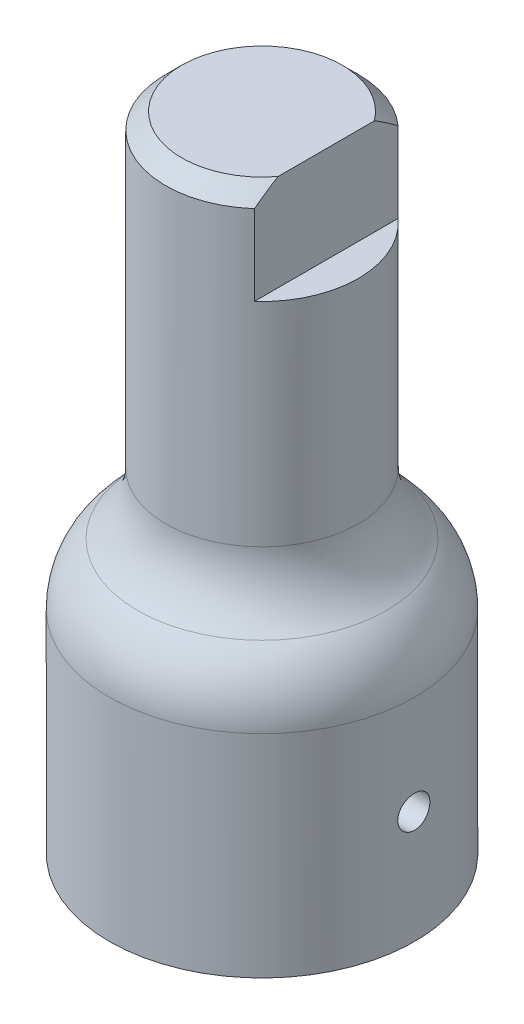
ISO-10303-21;
HEADER;
FILE_DESCRIPTION(('STEP AP214'),'2;1');
FILE_NAME('part.step','',(''),(''),'','','');
FILE_SCHEMA(('AUTOMOTIVE_DESIGN { 1 0 10303 214 1 1 1 1 }'));
ENDSEC;
DATA;
#1=APPLICATION_CONTEXT('core data for automotive mechanical design processes');
#2=APPLICATION_PROTOCOL_DEFINITION('international standard','automotive_design',2000,#1);
#3=PRODUCT_CONTEXT('',#1,'mechanical');
#4=PRODUCT('Part','Part','',(#3));
#5=PRODUCT_RELATED_PRODUCT_CATEGORY('part','',(#4));
#6=PRODUCT_DEFINITION_FORMATION('','',#4);
#7=PRODUCT_DEFINITION_CONTEXT('part definition',#1,'design');
#8=PRODUCT_DEFINITION('design','',#6,#7);
#9=PRODUCT_DEFINITION_SHAPE('','',#8);
#10=(LENGTH_UNIT() NAMED_UNIT(*) SI_UNIT(.MILLI.,.METRE.));
#11=(NAMED_UNIT(*) PLANE_ANGLE_UNIT() SI_UNIT($,.RADIAN.));
#12=(NAMED_UNIT(*) SI_UNIT($,.STERADIAN.) SOLID_ANGLE_UNIT());
#13=UNCERTAINTY_MEASURE_WITH_UNIT(LENGTH_MEASURE(1.E-05),#10,'distance_accuracy_value','');
#14=(GEOMETRIC_REPRESENTATION_CONTEXT(3) GLOBAL_UNCERTAINTY_ASSIGNED_CONTEXT((#13)) GLOBAL_UNIT_ASSIGNED_CONTEXT((#10,
#11,#12)) REPRESENTATION_CONTEXT('',''));
#15=CARTESIAN_POINT('',(0.,0.,0.));
#16=DIRECTION('',(0.,0.,1.));
#17=DIRECTION('',(1.,0.,0.));
#18=AXIS2_PLACEMENT_3D('',#15,#16,#17);
#19=CARTESIAN_POINT('',(0.,16.,0.));
#20=DIRECTION('',(0.,-1.,0.));
#21=DIRECTION('',(0.,0.,-1.));
#22=AXIS2_PLACEMENT_3D('',#19,#20,#21);
#23=CYLINDRICAL_SURFACE('',#22,6.);
#24=CARTESIAN_POINT('',(0.,14.,0.));
#25=DIRECTION('',(0.,1.,0.));
#26=DIRECTION('',(0.,0.,1.));
#27=AXIS2_PLACEMENT_3D('',#24,#25,#26);
#28=CIRCLE('',#27,6.);
#29=CARTESIAN_POINT('',(0.,14.,6.));
#30=VERTEX_POINT('',#29);
#31=EDGE_CURVE('E82',#30,#30,#28,.T.);
#32=ORIENTED_EDGE('',*,*,#31,.T.);
#33=EDGE_LOOP('',(#32));
#34=FACE_BOUND('',#33,.T.);
#35=CARTESIAN_POINT('',(0.,0.,0.));
#36=DIRECTION('',(0.,1.,0.));
#37=DIRECTION('',(0.,0.,1.));
#38=AXIS2_PLACEMENT_3D('',#35,#36,#37);
#39=CIRCLE('',#38,6.);
#40=CARTESIAN_POINT('',(0.,0.,6.));
#41=VERTEX_POINT('',#40);
#42=EDGE_CURVE('E90',#41,#41,#39,.T.);
#43=ORIENTED_EDGE('',*,*,#42,.F.);
#44=EDGE_LOOP('',(#43));
#45=FACE_BOUND('',#44,.T.);
#46=CARTESIAN_POINT('',(5.91607978309962,7.,1.));
#47=CARTESIAN_POINT('',(5.91608078960511,7.05575029925841,0.999997759368402));
#48=CARTESIAN_POINT('',(5.91687637019227,7.11153104240995,0.995322067614929));
#49=CARTESIAN_POINT('',(5.91996982947271,7.22152741728807,0.976750971230157));
#50=CARTESIAN_POINT('',(5.92226909356571,7.27574155749981,0.962847064123861));
#51=CARTESIAN_POINT('',(5.9281024372893,7.38099691334271,0.926251817466857));
#52=CARTESIAN_POINT('',(5.9316354846878,7.43204073946653,0.903567821972435));
#53=CARTESIAN_POINT('',(5.93953708845736,7.52959238188548,0.850074598756147));
#54=CARTESIAN_POINT('',(5.94390555078989,7.5761007078305,0.819266285400628));
#55=CARTESIAN_POINT('',(5.95303388461044,7.66372513989827,0.75007501078652));
#56=CARTESIAN_POINT('',(5.95779686930827,7.70479005255461,0.711627619572909));
#57=CARTESIAN_POINT('',(5.96714992267783,7.77991732274461,0.628388801878136));
#58=CARTESIAN_POINT('',(5.97173998108788,7.81397926524613,0.583596999659996));
#59=CARTESIAN_POINT('',(5.98026294792988,7.87432582688774,0.488609147979336));
#60=CARTESIAN_POINT('',(5.98419176972911,7.90056280309273,0.438382432582682));
#61=CARTESIAN_POINT('',(5.99091494782862,7.94420842821221,0.33415824868955));
#62=CARTESIAN_POINT('',(5.9937093778907,7.96161765115395,0.280161025631276));
#63=CARTESIAN_POINT('',(5.99782693889752,7.98695701399356,0.170457490537696));
#64=CARTESIAN_POINT('',(5.99916341244362,7.99497316640188,0.114771554671708));
#65=CARTESIAN_POINT('',(6.00026031737112,8.00156630166104,0.00283011421031903));
#66=CARTESIAN_POINT('',(6.00002085587723,8.00014392609889,-0.0534253514115594));
#67=CARTESIAN_POINT('',(5.99800343372556,7.98796745938872,-0.164320874031551));
#68=CARTESIAN_POINT('',(5.99624073476959,7.97730593463634,-0.218971412280057));
#69=CARTESIAN_POINT('',(5.99139191508655,7.9470995703014,-0.325696791844717));
#70=CARTESIAN_POINT('',(5.98830575405285,7.9275544601642,-0.377771554660602));
#71=CARTESIAN_POINT('',(5.98113079404783,7.88004374387387,-0.478142459113059));
#72=CARTESIAN_POINT('',(5.97703746930752,7.85203999516702,-0.526420209207618));
#73=CARTESIAN_POINT('',(5.96830295228599,7.78843487094598,-0.617626211938657));
#74=CARTESIAN_POINT('',(5.96366171567654,7.75283288051567,-0.660554031166351));
#75=CARTESIAN_POINT('',(5.95428107293039,7.67452847735228,-0.740388509378667));
#76=CARTESIAN_POINT('',(5.94954115892417,7.63174516203961,-0.777215800901283));
#77=CARTESIAN_POINT('',(5.94055183913922,7.54056516391367,-0.843181835379226));
#78=CARTESIAN_POINT('',(5.9363024378853,7.49216842932687,-0.872320507412967));
#79=CARTESIAN_POINT('',(5.92877501824727,7.39104334324901,-0.922097773795315));
#80=CARTESIAN_POINT('',(5.92549809321041,7.33831020076316,-0.942726810911697));
#81=CARTESIAN_POINT('',(5.92030475475952,7.23006037107698,-0.974811948326247));
#82=CARTESIAN_POINT('',(5.91838822155329,7.17454392942703,-0.986268856307183));
#83=CARTESIAN_POINT('',(5.91615583768847,7.06301353753515,-0.999572753951707));
#84=CARTESIAN_POINT('',(5.91582114303468,7.00701344811916,-1.00153288316498));
#85=CARTESIAN_POINT('',(5.91674013912944,6.89548533132367,-0.996089081072984));
#86=CARTESIAN_POINT('',(5.91799376852741,6.83995728579441,-0.988685511449866));
#87=CARTESIAN_POINT('',(5.92193074982007,6.73130889632366,-0.964820933971239));
#88=CARTESIAN_POINT('',(5.92460500767339,6.6781755440488,-0.948417516258554));
#89=CARTESIAN_POINT('',(5.93107429202201,6.57541193348821,-0.907079276076911));
#90=CARTESIAN_POINT('',(5.93486938556232,6.52578188497964,-0.882143943240374));
#91=CARTESIAN_POINT('',(5.94319651358957,6.43093016223756,-0.824182669291691));
#92=CARTESIAN_POINT('',(5.94773502240139,6.38575337089758,-0.791084225663745));
#93=CARTESIAN_POINT('',(5.95701866671947,6.301554586922,-0.717835786283193));
#94=CARTESIAN_POINT('',(5.96176381674133,6.2625330275561,-0.677685294553618));
#95=CARTESIAN_POINT('',(5.97098568847306,6.19133924290852,-0.590971228131524));
#96=CARTESIAN_POINT('',(5.97545910537869,6.15924246948618,-0.544345301354479));
#97=CARTESIAN_POINT('',(5.98358044973177,6.10333786919805,-0.446297379179731));
#98=CARTESIAN_POINT('',(5.9872284038799,6.07952977421046,-0.394875538988251));
#99=CARTESIAN_POINT('',(5.99327343267833,6.04099576641805,-0.288919620600531));
#100=CARTESIAN_POINT('',(5.99567593827049,6.02623036970603,-0.234400225041044));
#101=CARTESIAN_POINT('',(5.99898233267713,6.00607376041447,-0.123612293949685));
#102=CARTESIAN_POINT('',(5.99988634480071,6.00068177650706,-0.0673439027286496));
#103=CARTESIAN_POINT('',(6.0000921515513,5.99944724707512,0.0446165103094725));
#104=CARTESIAN_POINT('',(5.99941320809696,6.00348989842358,0.100307264241072));
#105=CARTESIAN_POINT('',(5.99656871354913,6.02076156890776,0.210204789725877));
#106=CARTESIAN_POINT('',(5.99440317078001,6.03399053660382,0.26441156958697));
#107=CARTESIAN_POINT('',(5.98882795531034,6.0692152662175,0.369758578367437));
#108=CARTESIAN_POINT('',(5.98541966816622,6.09120126728418,0.420902148861609));
#109=CARTESIAN_POINT('',(5.97773102750941,6.14330317449207,0.518792181192786));
#110=CARTESIAN_POINT('',(5.97345063265953,6.17341946602439,0.565538434446986));
#111=CARTESIAN_POINT('',(5.96443051847589,6.2413340369848,0.653885178210864));
#112=CARTESIAN_POINT('',(5.95968609820294,6.27921638190275,0.695420572242246));
#113=CARTESIAN_POINT('',(5.95030521321901,6.36141132315928,0.771585550379217));
#114=CARTESIAN_POINT('',(5.94566877405441,6.40572542355662,0.806213514680476));
#115=CARTESIAN_POINT('',(5.93699337428039,6.49989812900306,0.867805708367845));
#116=CARTESIAN_POINT('',(5.93295887192494,6.54979373593522,0.894713995637816));
#117=CARTESIAN_POINT('',(5.92599684088708,6.65344369436457,0.939725814576365));
#118=CARTESIAN_POINT('',(5.92306820700509,6.70719412907876,0.957838142092641));
#119=CARTESIAN_POINT('',(5.91929897935112,6.80096150779067,0.980810421248857));
#120=CARTESIAN_POINT('',(5.91809849368407,6.84041072318337,0.987994967068111));
#121=CARTESIAN_POINT('',(5.91648854114608,6.91990139393644,0.997590518072969));
#122=CARTESIAN_POINT('',(5.91607905991511,6.95994283853206,1.00000160991677));
#123=CARTESIAN_POINT('',(5.91607978309962,7.,1.));
#124=B_SPLINE_CURVE_WITH_KNOTS('',3,(#46,#47,#48,#49,#50,#51,#52,#53,#54,#55,#56,#57,#58,#59,
#60,#61,#62,#63,#64,#65,#66,#67,#68,#69,#70,#71,#72,#73,#74,#75,#76,#77,#78,#79,#80,#81,#82,#83,
#84,#85,#86,#87,#88,#89,#90,#91,#92,#93,#94,#95,#96,#97,#98,#99,#100,#101,#102,#103,#104,#105,
#106,#107,#108,#109,#110,#111,#112,#113,#114,#115,#116,#117,#118,#119,#120,#121,#122,#123),
.UNSPECIFIED.,.T.,.F.,(4,2,2,2,2,2,2,2,2,2,2,2,2,2,2,2,2,2,2,2,2,2,2,2,2,2,2,2,2,2,2,2,2,2,2,2,
2,2,4),(0.,0.167104415562128,0.33436300796778,0.501481999132667,0.668582189603687,
0.83715663660545,1.00574107132038,1.17533192042833,1.34491174042704,1.51292626987285,
1.68092937859336,1.84726848464127,2.01361265698072,2.18071841654029,2.34783770488965,
2.51698449383108,2.68613284296667,2.85547064997701,3.0247935437349,3.19209416966423,
3.3593883336385,3.52562425852456,3.69187012915689,3.8596493710334,4.02744041770535,
4.19697645212412,4.36650700188939,4.53529193765318,4.704062983632,4.87079110504626,
5.03751829285789,5.20406015931242,5.37060992155193,5.5390679898356,5.70756551550984,
5.8772549104514,6.04677426695051,6.16684268214775,6.28690891757997),.UNSPECIFIED.);
#125=CARTESIAN_POINT('',(5.91607978309962,7.,1.));
#126=VERTEX_POINT('',#125);
#127=EDGE_CURVE('E152',#126,#126,#124,.T.);
#128=ORIENTED_EDGE('',*,*,#127,.F.);
#129=EDGE_LOOP('',(#128));
#130=FACE_BOUND('',#129,.T.);
#131=ADVANCED_FACE('F41',(#34,#45,#130),#23,.F.);
#132=CARTESIAN_POINT('',(0.,16.,0.));
#133=DIRECTION('',(0.,-1.,0.));
#134=DIRECTION('',(0.,0.,-1.));
#135=AXIS2_PLACEMENT_3D('',#132,#133,#134);
#136=CYLINDRICAL_SURFACE('',#135,9.5);
#137=CARTESIAN_POINT('',(0.,13.1703539302994,0.));
#138=DIRECTION('',(0.,-1.,0.));
#139=DIRECTION('',(0.,0.,-1.));
#140=AXIS2_PLACEMENT_3D('',#137,#138,#139);
#141=CIRCLE('',#140,9.5);
#142=CARTESIAN_POINT('',(0.,13.1703539302994,-9.5));
#143=VERTEX_POINT('',#142);
#144=EDGE_CURVE('E11',#143,#143,#141,.T.);
#145=ORIENTED_EDGE('',*,*,#144,.T.);
#146=EDGE_LOOP('',(#145));
#147=FACE_BOUND('',#146,.T.);
#148=CARTESIAN_POINT('',(0.,0.,0.));
#149=DIRECTION('',(0.,1.,0.));
#150=DIRECTION('',(0.,0.,1.));
#151=AXIS2_PLACEMENT_3D('',#148,#149,#150);
#152=CIRCLE('',#151,9.5);
#153=CARTESIAN_POINT('',(0.,0.,9.5));
#154=VERTEX_POINT('',#153);
#155=EDGE_CURVE('E95',#154,#154,#152,.T.);
#156=ORIENTED_EDGE('',*,*,#155,.T.);
#157=EDGE_LOOP('',(#156));
#158=FACE_BOUND('',#157,.T.);
#159=CARTESIAN_POINT('',(9.44722181384559,7.,1.));
#160=CARTESIAN_POINT('',(9.44722250266399,7.05600323977769,0.99999758200504));
#161=CARTESIAN_POINT('',(9.44772516447025,7.1120431202978,0.995279605314901));
#162=CARTESIAN_POINT('',(9.44968112934553,7.22256802880414,0.976530575638431));
#163=CARTESIAN_POINT('',(9.45113546960823,7.27705129260845,0.962489361408322));
#164=CARTESIAN_POINT('',(9.45482827329693,7.38284646327565,0.925508243054437));
#165=CARTESIAN_POINT('',(9.45706625036201,7.43416031403647,0.902573857494191));
#166=CARTESIAN_POINT('',(9.46207356819287,7.53219959413971,0.848468268709646));
#167=CARTESIAN_POINT('',(9.46484280623326,7.57892590789863,0.817298657421768));
#168=CARTESIAN_POINT('',(9.47061306994568,7.66666202048867,0.747473131447721));
#169=CARTESIAN_POINT('',(9.47361488826576,7.70765080271592,0.708790872156584));
#170=CARTESIAN_POINT('',(9.47950490283494,7.78256723957361,0.62509450014844));
#171=CARTESIAN_POINT('',(9.4823930937953,7.81649456584542,0.580080093148767));
#172=CARTESIAN_POINT('',(9.48773832873555,7.87639828614689,0.484867702730016));
#173=CARTESIAN_POINT('',(9.49019435323658,7.90235598442036,0.434657894607717));
#174=CARTESIAN_POINT('',(9.49438988246007,7.94546397473997,0.330561942132096));
#175=CARTESIAN_POINT('',(9.49612940639459,7.96261450294246,0.276675896397673));
#176=CARTESIAN_POINT('',(9.49869036912673,7.98755941118926,0.166970075945795));
#177=CARTESIAN_POINT('',(9.4995152042548,7.99538841103176,0.111158253620165));
#178=CARTESIAN_POINT('',(9.50016541360392,8.00157517916979,-0.000992835185781956));
#179=CARTESIAN_POINT('',(9.49999081632174,7.99993321751047,-0.0573320865818038));
#180=CARTESIAN_POINT('',(9.49866460674142,7.98725270557985,-0.168703652078326));
#181=CARTESIAN_POINT('',(9.4975168652733,7.97625138301352,-0.223740257380181));
#182=CARTESIAN_POINT('',(9.49437776823862,7.94522247056722,-0.331181565951239));
#183=CARTESIAN_POINT('',(9.49238640070667,7.92519475266294,-0.383586231879072));
#184=CARTESIAN_POINT('',(9.48777724512953,7.87664098179201,-0.484393029454017));
#185=CARTESIAN_POINT('',(9.4851582498829,7.84809852504856,-0.532787202758799));
#186=CARTESIAN_POINT('',(9.47958754859329,7.78333740666697,-0.624112447479546));
#187=CARTESIAN_POINT('',(9.47663583173319,7.74711849542568,-0.667043341182006));
#188=CARTESIAN_POINT('',(9.47071386481717,7.66782338450425,-0.746441553980419));
#189=CARTESIAN_POINT('',(9.46774359429255,7.62471478825671,-0.782876524755558));
#190=CARTESIAN_POINT('',(9.46213353822369,7.532976124428,-0.847998010788905));
#191=CARTESIAN_POINT('',(9.45949375324791,7.48434604734956,-0.876684512719004));
#192=CARTESIAN_POINT('',(9.45484337668268,7.38291923112184,-0.925494983579706));
#193=CARTESIAN_POINT('',(9.45283294031977,7.33012146804264,-0.945616840511517));
#194=CARTESIAN_POINT('',(9.44967206522172,7.22187081397363,-0.976700646432598));
#195=CARTESIAN_POINT('',(9.44852159738819,7.16641801288878,-0.987662905352755));
#196=CARTESIAN_POINT('',(9.44721601825639,7.05471569667896,-1.00007449042647));
#197=CARTESIAN_POINT('',(9.44705616649923,6.9984712689114,-1.00156912338335));
#198=CARTESIAN_POINT('',(9.44773740410882,6.88653277512161,-0.995122122181053));
#199=CARTESIAN_POINT('',(9.44857847846089,6.83083870085629,-0.987180629571162));
#200=CARTESIAN_POINT('',(9.45116248557082,6.72171463832316,-0.962124760080201));
#201=CARTESIAN_POINT('',(9.45290330202064,6.66827965405797,-0.945031905000059));
#202=CARTESIAN_POINT('',(9.457088931172,6.56503510704003,-0.902180520375012));
#203=CARTESIAN_POINT('',(9.45953376168103,6.51522563603178,-0.876421771630252));
#204=CARTESIAN_POINT('',(9.46486340159122,6.42043980641424,-0.816856703395603));
#205=CARTESIAN_POINT('',(9.46774983441864,6.3754823698289,-0.783020420843191));
#206=CARTESIAN_POINT('',(9.47363218095351,6.29186889539325,-0.708303604881554));
#207=CARTESIAN_POINT('',(9.47662809766472,6.25321303058971,-0.667422878089002));
#208=CARTESIAN_POINT('',(9.48240620792166,6.18314319657522,-0.579580811033079));
#209=CARTESIAN_POINT('',(9.48518749827024,6.15175882518888,-0.532595793455962));
#210=CARTESIAN_POINT('',(9.49020976547322,6.09732675207709,-0.433995477074839));
#211=CARTESIAN_POINT('',(9.49245075042118,6.07427892547094,-0.382380247645452));
#212=CARTESIAN_POINT('',(9.49613584419318,6.03722409187461,-0.276087032602511));
#213=CARTESIAN_POINT('',(9.49758151475308,6.02319935725015,-0.221415283364818));
#214=CARTESIAN_POINT('',(9.49951951574434,6.00453099519028,-0.110476924029592));
#215=CARTESIAN_POINT('',(9.50001187606999,5.99988707358727,-0.0542103639989389));
#216=CARTESIAN_POINT('',(9.49998774184331,6.0001165557393,0.0580300347921241));
#217=CARTESIAN_POINT('',(9.49947611139555,6.00494407253066,0.114003974054028));
#218=CARTESIAN_POINT('',(9.49751109070018,6.02388298821353,0.224340884848703));
#219=CARTESIAN_POINT('',(9.49605769994164,6.03799439214156,0.278703855507502));
#220=CARTESIAN_POINT('',(9.49237193768829,6.07508745806463,0.38427419542441));
#221=CARTESIAN_POINT('',(9.490139699013,6.09806760771371,0.43548210097553));
#222=CARTESIAN_POINT('',(9.48514475079928,6.15224100524974,0.533321310522369));
#223=CARTESIAN_POINT('',(9.48238204252499,6.18343423356451,0.579952625423966));
#224=CARTESIAN_POINT('',(9.4766194383916,6.25332005695263,0.667550047988317));
#225=CARTESIAN_POINT('',(9.47361849971248,6.29204683714375,0.708488814694207));
#226=CARTESIAN_POINT('',(9.46772640505434,6.37583199751859,0.783306479853838));
#227=CARTESIAN_POINT('',(9.46483527551713,6.42089189057828,0.817183686602054));
#228=CARTESIAN_POINT('',(9.45948152841544,6.51620336153075,0.876992670192274));
#229=CARTESIAN_POINT('',(9.4570201280027,6.56646906345693,0.902902032073805));
#230=CARTESIAN_POINT('',(9.45281896154563,6.6706322617773,0.945877463600504));
#231=CARTESIAN_POINT('',(9.45107838754954,6.7245256128207,0.962953439690973));
#232=CARTESIAN_POINT('',(9.44895178678448,6.81559943061549,0.983551575010371));
#233=CARTESIAN_POINT('',(9.44830614572659,6.85219901620581,0.989711221415893));
#234=CARTESIAN_POINT('',(9.44744093225495,6.92586038241047,0.997936224550725));
#235=CARTESIAN_POINT('',(9.44722135780237,6.96292216081225,1.00000160087218));
#236=CARTESIAN_POINT('',(9.44722181384559,7.,1.));
#237=B_SPLINE_CURVE_WITH_KNOTS('',3,(#159,#160,#161,#162,#163,#164,#165,#166,#167,#168,#169,
#170,#171,#172,#173,#174,#175,#176,#177,#178,#179,#180,#181,#182,#183,#184,#185,#186,#187,#188,
#189,#190,#191,#192,#193,#194,#195,#196,#197,#198,#199,#200,#201,#202,#203,#204,#205,#206,#207,
#208,#209,#210,#211,#212,#213,#214,#215,#216,#217,#218,#219,#220,#221,#222,#223,#224,#225,#226,
#227,#228,#229,#230,#231,#232,#233,#234,#235,#236),.UNSPECIFIED.,.T.,.F.,(4,2,2,2,2,2,2,2,2,2,2,
2,2,2,2,2,2,2,2,2,2,2,2,2,2,2,2,2,2,2,2,2,2,2,2,2,2,2,4),(0.,0.167874308515836,
0.335931881467919,0.503885334527947,0.671806344537529,0.840327196784645,1.00885588352368,
1.17777694897953,1.34669348473242,1.51498069435804,1.68326310564076,1.8508792712072,
2.01849781420309,2.18644138555292,2.35439041849688,2.52315376360364,2.69191739899767,
2.86072262658684,3.02952214212699,3.19751326274829,3.36550186340294,3.53309711962096,
3.70069661540383,3.86892774419037,4.03716349197577,4.20607244449903,4.37497886667637,
4.54355241740059,4.71212068184014,4.87987428784667,5.04762798486011,5.21535308824674,
5.38307779193977,5.55158212557546,5.7201267807443,5.8891413337759,6.05796592756899,
6.16911032609435,6.28025419276375),.UNSPECIFIED.);
#238=CARTESIAN_POINT('',(9.44722181384559,7.,1.));
#239=VERTEX_POINT('',#238);
#240=EDGE_CURVE('E160',#239,#239,#237,.T.);
#241=ORIENTED_EDGE('',*,*,#240,.T.);
#242=EDGE_LOOP('',(#241));
#243=FACE_BOUND('',#242,.T.);
#244=ADVANCED_FACE('F138',(#147,#158,#243),#136,.T.);
#245=CARTESIAN_POINT('',(0.,0.,0.));
#246=DIRECTION('',(0.,1.,0.));
#247=DIRECTION('',(0.,0.,1.));
#248=AXIS2_PLACEMENT_3D('',#245,#246,#247);
#249=PLANE('',#248);
#250=ORIENTED_EDGE('',*,*,#42,.T.);
#251=EDGE_LOOP('',(#250));
#252=FACE_BOUND('',#251,.T.);
#253=ORIENTED_EDGE('',*,*,#155,.F.);
#254=EDGE_LOOP('',(#253));
#255=FACE_BOUND('',#254,.T.);
#256=ADVANCED_FACE('F148',(#252,#255),#249,.F.);
#257=CARTESIAN_POINT('',(0.,34.,0.));
#258=DIRECTION('',(0.,-1.,0.));
#259=DIRECTION('',(0.,0.,-1.));
#260=AXIS2_PLACEMENT_3D('',#257,#258,#259);
#261=CYLINDRICAL_SURFACE('',#260,6.);
#262=CARTESIAN_POINT('',(0.,20.7696960070847,0.));
#263=DIRECTION('',(0.,-1.,0.));
#264=DIRECTION('',(0.,0.,-1.));
#265=AXIS2_PLACEMENT_3D('',#262,#263,#264);
#266=CIRCLE('',#265,6.);
#267=CARTESIAN_POINT('',(0.,20.7696960070847,-6.));
#268=VERTEX_POINT('',#267);
#269=EDGE_CURVE('E187',#268,#268,#266,.F.);
#270=ORIENTED_EDGE('',*,*,#269,.T.);
#271=EDGE_LOOP('',(#270));
#272=FACE_BOUND('',#271,.T.);
#273=DIRECTION('',(0.,-1.,0.));
#274=VECTOR('',#273,1.);
#275=CARTESIAN_POINT('',(4.,40.,4.47213595499958));
#276=LINE('',#275,#274);
#277=CARTESIAN_POINT('',(4.,39.,4.47213595499958));
#278=VERTEX_POINT('',#277);
#279=CARTESIAN_POINT('',(4.,34.,4.47213595499958));
#280=VERTEX_POINT('',#279);
#281=EDGE_CURVE('E85',#278,#280,#276,.T.);
#282=ORIENTED_EDGE('',*,*,#281,.F.);
#283=CARTESIAN_POINT('',(0.,39.,0.));
#284=DIRECTION('',(0.,1.,0.));
#285=DIRECTION('',(0.,0.,1.));
#286=AXIS2_PLACEMENT_3D('',#283,#284,#285);
#287=CIRCLE('',#286,6.);
#288=CARTESIAN_POINT('',(4.,39.,-4.47213595499958));
#289=VERTEX_POINT('',#288);
#290=EDGE_CURVE('E64',#278,#289,#287,.F.);
#291=ORIENTED_EDGE('',*,*,#290,.T.);
#292=DIRECTION('',(0.,-1.,0.));
#293=VECTOR('',#292,1.);
#294=CARTESIAN_POINT('',(4.,40.,-4.47213595499958));
#295=LINE('',#294,#293);
#296=CARTESIAN_POINT('',(4.,34.,-4.47213595499958));
#297=VERTEX_POINT('',#296);
#298=EDGE_CURVE('E74',#289,#297,#295,.T.);
#299=ORIENTED_EDGE('',*,*,#298,.T.);
#300=CARTESIAN_POINT('',(0.,34.,0.));
#301=DIRECTION('',(0.,1.,0.));
#302=DIRECTION('',(0.,0.,1.));
#303=AXIS2_PLACEMENT_3D('',#300,#301,#302);
#304=CIRCLE('',#303,6.);
#305=EDGE_CURVE('E79',#280,#297,#304,.T.);
#306=ORIENTED_EDGE('',*,*,#305,.F.);
#307=EDGE_LOOP('',(#282,#291,#299,#306));
#308=FACE_BOUND('',#307,.T.);
#309=ADVANCED_FACE('F76',(#272,#308),#261,.T.);
#310=CARTESIAN_POINT('',(0.,34.,0.));
#311=DIRECTION('',(0.,1.,0.));
#312=DIRECTION('',(0.,0.,1.));
#313=AXIS2_PLACEMENT_3D('',#310,#311,#312);
#314=PLANE('',#313);
#315=DIRECTION('',(0.,0.,1.));
#316=VECTOR('',#315,1.);
#317=CARTESIAN_POINT('',(4.,34.,0.));
#318=LINE('',#317,#316);
#319=EDGE_CURVE('E81',#297,#280,#318,.T.);
#320=ORIENTED_EDGE('',*,*,#319,.T.);
#321=ORIENTED_EDGE('',*,*,#305,.T.);
#322=EDGE_LOOP('',(#320,#321));
#323=FACE_BOUND('',#322,.T.);
#324=ADVANCED_FACE('F86',(#323),#314,.T.);
#325=CARTESIAN_POINT('',(0.,14.,0.));
#326=DIRECTION('',(0.,1.,0.));
#327=DIRECTION('',(0.,0.,1.));
#328=AXIS2_PLACEMENT_3D('',#325,#326,#327);
#329=PLANE('',#328);
#330=ORIENTED_EDGE('',*,*,#31,.F.);
#331=EDGE_LOOP('',(#330));
#332=FACE_BOUND('',#331,.T.);
#333=ADVANCED_FACE('F179',(#332),#329,.F.);
#334=CARTESIAN_POINT('',(0.,40.,0.));
#335=DIRECTION('',(0.,1.,0.));
#336=DIRECTION('',(0.,0.,1.));
#337=AXIS2_PLACEMENT_3D('',#334,#335,#336);
#338=PLANE('',#337);
#339=DIRECTION('',(0.,0.,1.));
#340=VECTOR('',#339,1.);
#341=CARTESIAN_POINT('',(4.,40.,0.));
#342=LINE('',#341,#340);
#343=CARTESIAN_POINT('',(4.,40.,-3.));
#344=VERTEX_POINT('',#343);
#345=CARTESIAN_POINT('',(4.,40.,3.));
#346=VERTEX_POINT('',#345);
#347=EDGE_CURVE('E156',#344,#346,#342,.T.);
#348=ORIENTED_EDGE('',*,*,#347,.F.);
#349=CARTESIAN_POINT('',(0.,40.,0.));
#350=DIRECTION('',(0.,1.,0.));
#351=DIRECTION('',(0.,0.,1.));
#352=AXIS2_PLACEMENT_3D('',#349,#350,#351);
#353=CIRCLE('',#352,5.);
#354=EDGE_CURVE('E97',#344,#346,#353,.T.);
#355=ORIENTED_EDGE('',*,*,#354,.T.);
#356=EDGE_LOOP('',(#348,#355));
#357=FACE_BOUND('',#356,.T.);
#358=ADVANCED_FACE('F175',(#357),#338,.T.);
#359=CARTESIAN_POINT('',(4.,40.,0.));
#360=DIRECTION('',(1.,0.,0.));
#361=DIRECTION('',(0.,0.,-1.));
#362=AXIS2_PLACEMENT_3D('',#359,#360,#361);
#363=PLANE('',#362);
#364=ORIENTED_EDGE('',*,*,#347,.T.);
#365=CARTESIAN_POINT('',(4.,40.,3.));
#366=CARTESIAN_POINT('',(4.,39.9235986442854,3.12726882082271));
#367=CARTESIAN_POINT('',(4.,39.8449840718697,3.25317779797631));
#368=CARTESIAN_POINT('',(4.,39.6841145948467,3.5025438219525));
#369=CARTESIAN_POINT('',(4.,39.6018619502241,3.62600232383175));
#370=CARTESIAN_POINT('',(4.,39.4344210609026,3.87086970507506));
#371=CARTESIAN_POINT('',(4.,39.349233311527,3.99227892516984));
#372=CARTESIAN_POINT('',(4.,39.1763564526067,4.23341801692586));
#373=CARTESIAN_POINT('',(4.,39.0886658457975,4.35314681661953));
#374=CARTESIAN_POINT('',(4.,39.,4.47213595499958));
#375=B_SPLINE_CURVE_WITH_KNOTS('',3,(#365,#366,#367,#368,#369,#370,#371,#372,#373,#374),
.UNSPECIFIED.,.F.,.F.,(4,2,2,2,4),(0.,0.445259803844281,0.890246792098669,1.33515904943513,
1.78034328473674),.UNSPECIFIED.);
#376=EDGE_CURVE('E57',#346,#278,#375,.T.);
#377=ORIENTED_EDGE('',*,*,#376,.T.);
#378=ORIENTED_EDGE('',*,*,#281,.T.);
#379=ORIENTED_EDGE('',*,*,#319,.F.);
#380=ORIENTED_EDGE('',*,*,#298,.F.);
#381=CARTESIAN_POINT('',(4.,39.,-4.47213595499958));
#382=CARTESIAN_POINT('',(4.,39.0886658457975,-4.35314681661953));
#383=CARTESIAN_POINT('',(4.,39.1763564526067,-4.23341801692586));
#384=CARTESIAN_POINT('',(4.,39.349233311527,-3.99227892516984));
#385=CARTESIAN_POINT('',(4.,39.4344210609026,-3.87086970507506));
#386=CARTESIAN_POINT('',(4.,39.6018619502241,-3.62600232383175));
#387=CARTESIAN_POINT('',(4.,39.6841145948467,-3.5025438219525));
#388=CARTESIAN_POINT('',(4.,39.8449840718697,-3.25317779797631));
#389=CARTESIAN_POINT('',(4.,39.9235986442854,-3.12726882082271));
#390=CARTESIAN_POINT('',(4.,40.,-3.00000000000001));
#391=B_SPLINE_CURVE_WITH_KNOTS('',3,(#381,#382,#383,#384,#385,#386,#387,#388,#389,#390),
.UNSPECIFIED.,.F.,.F.,(4,2,2,2,4),(0.,0.445184235301612,0.890096492638068,1.33508348089246,
1.78034328473674),.UNSPECIFIED.);
#392=EDGE_CURVE('E105',#289,#344,#391,.T.);
#393=ORIENTED_EDGE('',*,*,#392,.T.);
#394=EDGE_LOOP('',(#364,#377,#378,#379,#380,#393));
#395=FACE_BOUND('',#394,.T.);
#396=ADVANCED_FACE('F83',(#395),#363,.T.);
#397=CARTESIAN_POINT('',(9.501,7.,0.));
#398=DIRECTION('',(-1.,0.,0.));
#399=DIRECTION('',(0.,0.,1.));
#400=AXIS2_PLACEMENT_3D('',#397,#398,#399);
#401=CYLINDRICAL_SURFACE('',#400,1.);
#402=ORIENTED_EDGE('',*,*,#127,.T.);
#403=EDGE_LOOP('',(#402));
#404=FACE_BOUND('',#403,.T.);
#405=ORIENTED_EDGE('',*,*,#240,.F.);
#406=EDGE_LOOP('',(#405));
#407=FACE_BOUND('',#406,.T.);
#408=ADVANCED_FACE('F127',(#404,#407),#401,.F.);
#409=CARTESIAN_POINT('',(0.,40.,0.));
#410=DIRECTION('',(0.,-1.,0.));
#411=DIRECTION('',(0.,0.,-1.));
#412=AXIS2_PLACEMENT_3D('',#409,#410,#411);
#413=CONICAL_SURFACE('',#412,5.,0.78539816339745);
#414=ORIENTED_EDGE('',*,*,#392,.F.);
#415=ORIENTED_EDGE('',*,*,#290,.F.);
#416=ORIENTED_EDGE('',*,*,#376,.F.);
#417=ORIENTED_EDGE('',*,*,#354,.F.);
#418=EDGE_LOOP('',(#414,#415,#416,#417));
#419=FACE_BOUND('',#418,.T.);
#420=ADVANCED_FACE('F118',(#419),#413,.T.);
#421=CARTESIAN_POINT('',(0.,20.7696960070847,0.));
#422=DIRECTION('',(0.,-1.,0.));
#423=DIRECTION('',(0.,0.,-1.));
#424=AXIS2_PLACEMENT_3D('',#421,#422,#423);
#425=TOROIDAL_SURFACE('',#424,11.,5.);
#426=CARTESIAN_POINT('',(0.,16.9700249686921,0.));
#427=DIRECTION('',(0.,1.,0.));
#428=DIRECTION('',(0.,0.,1.));
#429=AXIS2_PLACEMENT_3D('',#426,#427,#428);
#430=CIRCLE('',#429,7.75);
#431=CARTESIAN_POINT('',(0.,16.9700249686921,7.75));
#432=VERTEX_POINT('',#431);
#433=EDGE_CURVE('E47',#432,#432,#430,.T.);
#434=ORIENTED_EDGE('',*,*,#433,.T.);
#435=EDGE_LOOP('',(#434));
#436=FACE_BOUND('',#435,.T.);
#437=ORIENTED_EDGE('',*,*,#269,.F.);
#438=EDGE_LOOP('',(#437));
#439=FACE_BOUND('',#438,.T.);
#440=ADVANCED_FACE('F123',(#436,#439),#425,.F.);
#441=CARTESIAN_POINT('',(0.,13.1703539302994,0.));
#442=DIRECTION('',(0.,-1.,0.));
#443=DIRECTION('',(0.,0.,-1.));
#444=AXIS2_PLACEMENT_3D('',#441,#442,#443);
#445=DEGENERATE_TOROIDAL_SURFACE('',#444,4.5,5.,.T.);
#446=ORIENTED_EDGE('',*,*,#144,.F.);
#447=EDGE_LOOP('',(#446));
#448=FACE_BOUND('',#447,.T.);
#449=ORIENTED_EDGE('',*,*,#433,.F.);
#450=EDGE_LOOP('',(#449));
#451=FACE_BOUND('',#450,.T.);
#452=ADVANCED_FACE('F43',(#448,#451),#445,.T.);
#453=CLOSED_SHELL('',(#131,#244,#256,#309,#324,#333,#358,#396,#408,#420,#440,#452));
#454=MANIFOLD_SOLID_BREP('B2',#453);
#455=ADVANCED_BREP_SHAPE_REPRESENTATION('',(#18,#454),#14);
#456=SHAPE_DEFINITION_REPRESENTATION(#9,#455);
ENDSEC;
END-ISO-10303-21;
